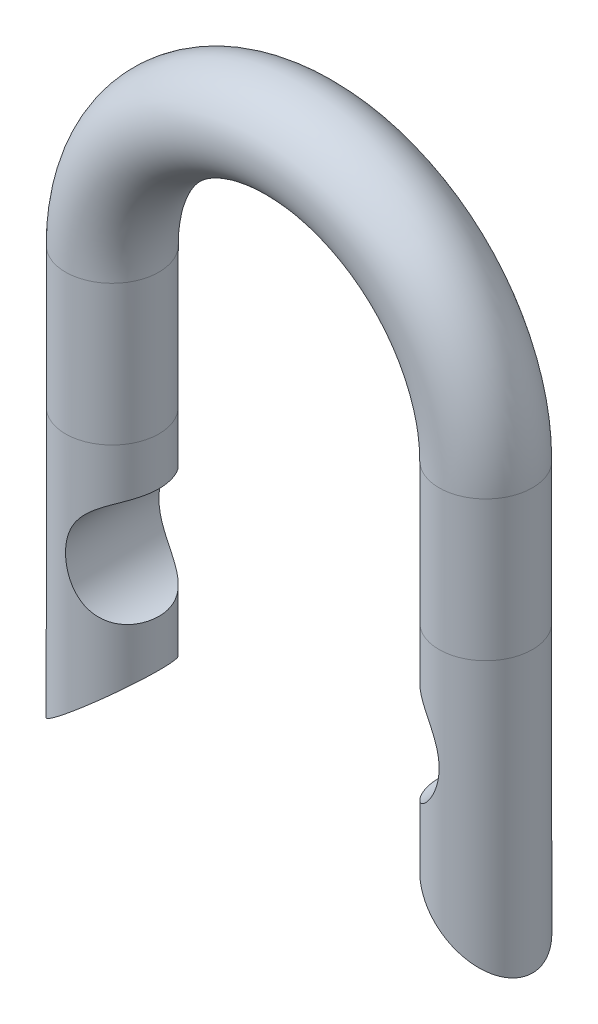
ISO-10303-21;
HEADER;
FILE_DESCRIPTION(('STEP AP214'),'2;1');
FILE_NAME('part.step','',(''),(''),'','','');
FILE_SCHEMA(('AUTOMOTIVE_DESIGN { 1 0 10303 214 1 1 1 1 }'));
ENDSEC;
DATA;
#1=APPLICATION_CONTEXT('core data for automotive mechanical design processes');
#2=APPLICATION_PROTOCOL_DEFINITION('international standard','automotive_design',2000,#1);
#3=PRODUCT_CONTEXT('',#1,'mechanical');
#4=PRODUCT('Part','Part','',(#3));
#5=PRODUCT_RELATED_PRODUCT_CATEGORY('part','',(#4));
#6=PRODUCT_DEFINITION_FORMATION('','',#4);
#7=PRODUCT_DEFINITION_CONTEXT('part definition',#1,'design');
#8=PRODUCT_DEFINITION('design','',#6,#7);
#9=PRODUCT_DEFINITION_SHAPE('','',#8);
#10=(LENGTH_UNIT() NAMED_UNIT(*) SI_UNIT(.MILLI.,.METRE.));
#11=(NAMED_UNIT(*) PLANE_ANGLE_UNIT() SI_UNIT($,.RADIAN.));
#12=(NAMED_UNIT(*) SI_UNIT($,.STERADIAN.) SOLID_ANGLE_UNIT());
#13=UNCERTAINTY_MEASURE_WITH_UNIT(LENGTH_MEASURE(1.E-05),#10,'distance_accuracy_value','');
#14=(GEOMETRIC_REPRESENTATION_CONTEXT(3) GLOBAL_UNCERTAINTY_ASSIGNED_CONTEXT((#13)) GLOBAL_UNIT_ASSIGNED_CONTEXT((#10,
#11,#12)) REPRESENTATION_CONTEXT('',''));
#15=CARTESIAN_POINT('',(0.,0.,0.));
#16=DIRECTION('',(0.,0.,1.));
#17=DIRECTION('',(1.,0.,0.));
#18=AXIS2_PLACEMENT_3D('',#15,#16,#17);
#19=CARTESIAN_POINT('',(0.,-30.,0.));
#20=DIRECTION('',(0.,1.,0.));
#21=DIRECTION('',(-1.,0.,0.));
#22=AXIS2_PLACEMENT_3D('',#19,#20,#21);
#23=CYLINDRICAL_SURFACE('',#22,5.);
#24=CARTESIAN_POINT('',(0.,0.,0.));
#25=DIRECTION('',(0.,-1.,0.));
#26=DIRECTION('',(1.,0.,0.));
#27=AXIS2_PLACEMENT_3D('',#24,#25,#26);
#28=CIRCLE('',#27,5.);
#29=CARTESIAN_POINT('',(5.,0.,0.));
#30=VERTEX_POINT('',#29);
#31=EDGE_CURVE('E131',#30,#30,#28,.T.);
#32=ORIENTED_EDGE('',*,*,#31,.T.);
#33=EDGE_LOOP('',(#32));
#34=FACE_BOUND('',#33,.T.);
#35=CARTESIAN_POINT('',(0.,-11.,-5.));
#36=CARTESIAN_POINT('',(1.01336783800378E-06,-11.1672925801468,-5.00000197803452));
#37=CARTESIAN_POINT('',(0.00700294385345058,-11.3346241016501,-5.00001524224182));
#38=CARTESIAN_POINT('',(0.0349715694115273,-11.6681851905817,-4.99989666422168));
#39=CARTESIAN_POINT('',(0.0559457322242584,-11.834414120699,-4.9997647443731));
#40=CARTESIAN_POINT('',(0.111789647046097,-12.1649643093046,-4.99882839915884));
#41=CARTESIAN_POINT('',(0.146694855048768,-12.3292795906052,-4.99802225203295));
#42=CARTESIAN_POINT('',(0.230145928593831,-12.6543708298637,-4.99487477657914));
#43=CARTESIAN_POINT('',(0.278689875745722,-12.8151472821572,-4.99253366409384));
#44=CARTESIAN_POINT('',(0.389162713133028,-13.1323120453173,-4.98514005902047));
#45=CARTESIAN_POINT('',(0.451116256336231,-13.2886916663659,-4.98008254673262));
#46=CARTESIAN_POINT('',(0.587862653343399,-13.5955704741037,-4.96579714411467));
#47=CARTESIAN_POINT('',(0.662656919850568,-13.7460690115324,-4.95656879473726));
#48=CARTESIAN_POINT('',(0.824246943154159,-14.039672919685,-4.9322692020561));
#49=CARTESIAN_POINT('',(0.911022474518513,-14.1827902028445,-4.91720772982427));
#50=CARTESIAN_POINT('',(1.09569186813046,-14.4605705269973,-4.87937828578128));
#51=CARTESIAN_POINT('',(1.1935821228077,-14.5952362892392,-4.85661280977911));
#52=CARTESIAN_POINT('',(1.37488784526161,-14.824180991063,-4.8079406341871));
#53=CARTESIAN_POINT('',(1.45627768794766,-14.9204984811257,-4.78403864642175));
#54=CARTESIAN_POINT('',(1.62396021911917,-15.1068201378297,-4.72974789953746));
#55=CARTESIAN_POINT('',(1.7102518365276,-15.1968256741517,-4.69936055355064));
#56=CARTESIAN_POINT('',(1.88671252194471,-15.3699118620849,-4.63133327985926));
#57=CARTESIAN_POINT('',(1.97687875140842,-15.45299745643,-4.59369859349857));
#58=CARTESIAN_POINT('',(2.15998853001141,-15.6118325943823,-4.51049434700005));
#59=CARTESIAN_POINT('',(2.25293212490629,-15.6875820170427,-4.46492465607754));
#60=CARTESIAN_POINT('',(2.44073891860501,-15.8317434599371,-4.36510662286157));
#61=CARTESIAN_POINT('',(2.53560945034013,-15.900116418207,-4.31081553815691));
#62=CARTESIAN_POINT('',(2.7253347593594,-16.0288879153695,-4.19344610079518));
#63=CARTESIAN_POINT('',(2.82018953661118,-16.0892864380785,-4.13036773030549));
#64=CARTESIAN_POINT('',(3.0083560839218,-16.2021250706699,-3.99539721518141));
#65=CARTESIAN_POINT('',(3.10166780150363,-16.254564910384,-3.92350477149123));
#66=CARTESIAN_POINT('',(3.28524187273531,-16.3517170487891,-3.77112873595935));
#67=CARTESIAN_POINT('',(3.37550436965556,-16.396429710956,-3.69064554850273));
#68=CARTESIAN_POINT('',(3.54434112740955,-16.4751889815033,-3.52848445564132));
#69=CARTESIAN_POINT('',(3.62326622768798,-16.5098102697967,-3.44744877088407));
#70=CARTESIAN_POINT('',(3.77644343900029,-16.5733900285891,-3.27893932747288));
#71=CARTESIAN_POINT('',(3.85069393086188,-16.6023465441858,-3.19146336057296));
#72=CARTESIAN_POINT('',(3.99364330429571,-16.6551161798921,-3.01066315708691));
#73=CARTESIAN_POINT('',(4.06234340245561,-16.6789304290569,-2.91734021010293));
#74=CARTESIAN_POINT('',(4.19354535772999,-16.7220182607628,-2.72538083419038));
#75=CARTESIAN_POINT('',(4.25604439552546,-16.7412897833767,-2.62674201956184));
#76=CARTESIAN_POINT('',(4.37684740629704,-16.7766349402529,-2.42035672065159));
#77=CARTESIAN_POINT('',(4.43484506182059,-16.7925301860826,-2.31240043176394));
#78=CARTESIAN_POINT('',(4.54291228696819,-16.820654104223,-2.09212825886974));
#79=CARTESIAN_POINT('',(4.59298133622372,-16.8328825359212,-1.97981208931833));
#80=CARTESIAN_POINT('',(4.68480487094448,-16.8542707573696,-1.75149908736753));
#81=CARTESIAN_POINT('',(4.7265560985081,-16.8634293456867,-1.63550083332144));
#82=CARTESIAN_POINT('',(4.80140231115474,-16.8791857964511,-1.4006165135319));
#83=CARTESIAN_POINT('',(4.83449975487999,-16.8857843864825,-1.28173127852735));
#84=CARTESIAN_POINT('',(4.89420545494826,-16.8973063128931,-1.03179398044238));
#85=CARTESIAN_POINT('',(4.92004866829745,-16.9020455080456,-0.900550082515578));
#86=CARTESIAN_POINT('',(4.96114196225866,-16.909417011739,-0.636353207497297));
#87=CARTESIAN_POINT('',(4.97639150207697,-16.9120492127214,-0.503400143507859));
#88=CARTESIAN_POINT('',(4.99618749969378,-16.9154426655211,-0.236645837589824));
#89=CARTESIAN_POINT('',(5.00073158971865,-16.9162035034422,-0.102844414586017));
#90=CARTESIAN_POINT('',(4.99907716495461,-16.9159237348083,0.164689947770474));
#91=CARTESIAN_POINT('',(4.99287855911732,-16.9148831129854,0.298422886533118));
#92=CARTESIAN_POINT('',(4.96939310831371,-16.9108373089725,0.569426996670404));
#93=CARTESIAN_POINT('',(4.95173980330404,-16.9077671337997,0.70666561653099));
#94=CARTESIAN_POINT('',(4.90513826618563,-16.8993082191888,0.979144195767172));
#95=CARTESIAN_POINT('',(4.87618967609224,-16.8939194062649,1.11438409165564));
#96=CARTESIAN_POINT('',(4.80722729922888,-16.8803509783983,1.38190028396456));
#97=CARTESIAN_POINT('',(4.76721143035376,-16.8721708382509,1.51417601766539));
#98=CARTESIAN_POINT('',(4.6764657992479,-16.8523851829379,1.77473875520055));
#99=CARTESIAN_POINT('',(4.6257362405089,-16.8407797328297,1.90302583474078));
#100=CARTESIAN_POINT('',(4.51456210787274,-16.8134944525269,2.15344402742041));
#101=CARTESIAN_POINT('',(4.45421160627154,-16.7978532501379,2.27562105974464));
#102=CARTESIAN_POINT('',(4.32410024943759,-16.7615898813437,2.51408049301391));
#103=CARTESIAN_POINT('',(4.25434016954927,-16.740968125223,2.63036337854864));
#104=CARTESIAN_POINT('',(4.10627328170704,-16.6938412547095,2.85599631875508));
#105=CARTESIAN_POINT('',(4.02797195998117,-16.6673399057286,2.9653507531845));
#106=CARTESIAN_POINT('',(3.86383081902116,-16.6075310734903,3.1762653939161));
#107=CARTESIAN_POINT('',(3.77799166070537,-16.5742241866041,3.27782628209697));
#108=CARTESIAN_POINT('',(3.60597684458867,-16.5024312068577,3.465843735025));
#109=CARTESIAN_POINT('',(3.52020272370516,-16.4644364607337,3.55285554936384));
#110=CARTESIAN_POINT('',(3.34443611867584,-16.3812108589448,3.71878343810715));
#111=CARTESIAN_POINT('',(3.2544438576947,-16.3359803857881,3.79769994009897));
#112=CARTESIAN_POINT('',(3.07166582163871,-16.2379010507893,3.94699736365622));
#113=CARTESIAN_POINT('',(2.97888150181223,-16.1850561050799,4.0173826387894));
#114=CARTESIAN_POINT('',(2.79194766846745,-16.0715237720856,4.14947297942389));
#115=CARTESIAN_POINT('',(2.69779821211652,-16.0108367123652,4.21117840725692));
#116=CARTESIAN_POINT('',(2.51663436791631,-15.886443034579,4.32168507456124));
#117=CARTESIAN_POINT('',(2.42961052305963,-15.8232974186078,4.37110495422635));
#118=CARTESIAN_POINT('',(2.25677429851572,-15.6904312417553,4.46279550411627));
#119=CARTESIAN_POINT('',(2.17096234524144,-15.6207084297976,4.50506371271952));
#120=CARTESIAN_POINT('',(2.00164106665452,-15.4749972961191,4.58280626690303));
#121=CARTESIAN_POINT('',(1.91813148928324,-15.3990096639198,4.61828135872603));
#122=CARTESIAN_POINT('',(1.75430171027042,-15.241107880852,4.68296771866402));
#123=CARTESIAN_POINT('',(1.67398271208117,-15.1591915259989,4.71217664118806));
#124=CARTESIAN_POINT('',(1.51342367155993,-14.9856367230723,4.76624400390401));
#125=CARTESIAN_POINT('',(1.43339007081028,-14.893716645375,4.79081037881119));
#126=CARTESIAN_POINT('',(1.27847493343338,-14.7043454961125,4.83445783581607));
#127=CARTESIAN_POINT('',(1.20359555036516,-14.6068921432715,4.85353663552585));
#128=CARTESIAN_POINT('',(1.05961441046474,-14.4070168762363,4.88699110550942));
#129=CARTESIAN_POINT('',(0.990513737163655,-14.304594035907,4.90136589522799));
#130=CARTESIAN_POINT('',(0.858575926418677,-14.0953293498117,4.92619063820214));
#131=CARTESIAN_POINT('',(0.795739514351063,-13.9884869943055,4.93664013731175));
#132=CARTESIAN_POINT('',(0.666843550591963,-13.7528774145726,4.95582929010031));
#133=CARTESIAN_POINT('',(0.60197514434783,-13.6234107191739,4.9639987298238));
#134=CARTESIAN_POINT('',(0.48171902886084,-13.3599884317115,4.97710819747061));
#135=CARTESIAN_POINT('',(0.426332154627238,-13.2260324455307,4.98204794107245));
#136=CARTESIAN_POINT('',(0.325360177774828,-12.9543472762797,4.9896599689942));
#137=CARTESIAN_POINT('',(0.279779455592821,-12.8166164378148,4.99233124154527));
#138=CARTESIAN_POINT('',(0.198708727167981,-12.5381958439052,4.99621465166712));
#139=CARTESIAN_POINT('',(0.163219205918918,-12.3975059465937,4.99742671911602));
#140=CARTESIAN_POINT('',(0.0984924054892949,-12.0950741126401,4.99914895651438));
#141=CARTESIAN_POINT('',(0.0707114976076093,-11.9330178432994,4.99954452650008));
#142=CARTESIAN_POINT('',(0.0285389473373053,-11.607163973421,4.99996292888112));
#143=CARTESIAN_POINT('',(0.0141484027150768,-11.4433662312274,4.99998573071878));
#144=CARTESIAN_POINT('',(-0.00114534127759506,-11.1151177837661,5.00000581531103));
#145=CARTESIAN_POINT('',(-0.00204666289751859,-10.9506669907784,5.00000309451284));
#146=CARTESIAN_POINT('',(0.00964912549334279,-10.6222483515103,4.99999401562876));
#147=CARTESIAN_POINT('',(0.0222461739106748,-10.4582805030295,4.99998765755946));
#148=CARTESIAN_POINT('',(0.0613602917098796,-10.1276531704375,4.9996628502361));
#149=CARTESIAN_POINT('',(0.088233342704779,-9.96103568583118,4.99933623034002));
#150=CARTESIAN_POINT('',(0.155915407421652,-9.63065341419806,4.9976828947871));
#151=CARTESIAN_POINT('',(0.196724971284217,-9.46688874005353,4.99635613964767));
#152=CARTESIAN_POINT('',(0.292017942210682,-9.14327936115905,4.99169323766335));
#153=CARTESIAN_POINT('',(0.346511479138238,-8.98343765712824,4.98835559964535));
#154=CARTESIAN_POINT('',(0.468735520316024,-8.66899977092882,4.97835761639618));
#155=CARTESIAN_POINT('',(0.5364656772879,-8.51440345126622,4.97169735833076));
#156=CARTESIAN_POINT('',(0.684036998870277,-8.21279472978758,4.95354186067828));
#157=CARTESIAN_POINT('',(0.763785538316597,-8.06573495799586,4.94208249930568));
#158=CARTESIAN_POINT('',(0.934971313376137,-7.7792354240144,4.91257250014844));
#159=CARTESIAN_POINT('',(1.02640943752949,-7.63979624222666,4.8945213611206));
#160=CARTESIAN_POINT('',(1.21966538251949,-7.37014340733225,4.84997185062209));
#161=CARTESIAN_POINT('',(1.32146189071916,-7.23991170975088,4.82349059445501));
#162=CARTESIAN_POINT('',(1.5340495006407,-6.98973899863895,4.76014414032647));
#163=CARTESIAN_POINT('',(1.64483679967864,-6.86979367814771,4.72328331631152));
#164=CARTESIAN_POINT('',(1.84235663141479,-6.67242745544965,4.64904699210233));
#165=CARTESIAN_POINT('',(1.9274665394985,-6.59229455007946,4.61452098890251));
#166=CARTESIAN_POINT('',(2.10040070808419,-6.43858624102623,4.53841763443072));
#167=CARTESIAN_POINT('',(2.18822436992665,-6.36500940477504,4.49684182940497));
#168=CARTESIAN_POINT('',(2.36543460815921,-6.2247830849532,4.40620202742989));
#169=CARTESIAN_POINT('',(2.45482025876951,-6.15812965043007,4.35714234118277));
#170=CARTESIAN_POINT('',(2.63398679064456,-6.03190541586923,4.25122816751938));
#171=CARTESIAN_POINT('',(2.72376768464208,-5.97233484576346,4.19437342718018));
#172=CARTESIAN_POINT('',(2.90262156398862,-5.86021286541557,4.07265409575176));
#173=CARTESIAN_POINT('',(2.99169272152231,-5.80767609006022,4.00777332847161));
#174=CARTESIAN_POINT('',(3.16764878343352,-5.70963778731315,3.87020307576345));
#175=CARTESIAN_POINT('',(3.2545336828834,-5.66413627577707,3.79751357273722));
#176=CARTESIAN_POINT('',(3.42491545213415,-5.57985431104011,3.64459360564037));
#177=CARTESIAN_POINT('',(3.50841112969204,-5.54107620753858,3.5643605202831));
#178=CARTESIAN_POINT('',(3.6708609400847,-5.4698118072156,3.39682131530969));
#179=CARTESIAN_POINT('',(3.74981507224416,-5.43732551132971,3.30951519464183));
#180=CARTESIAN_POINT('',(3.90007175823033,-5.37891302567467,3.13092285408266));
#181=CARTESIAN_POINT('',(3.9715264214635,-5.35282896628892,3.03981588200658));
#182=CARTESIAN_POINT('',(4.10848258645064,-5.30549255887314,2.85199660943286));
#183=CARTESIAN_POINT('',(4.17398197357312,-5.28424192313032,2.75528233767391));
#184=CARTESIAN_POINT('',(4.2983698185709,-5.24598483796435,2.55689754562903));
#185=CARTESIAN_POINT('',(4.35725832795224,-5.22897835547329,2.45522706396632));
#186=CARTESIAN_POINT('',(4.4679217680021,-5.19861832544165,2.24755894799921));
#187=CARTESIAN_POINT('',(4.51969618566185,-5.18526504127042,2.14156100234849));
#188=CARTESIAN_POINT('',(4.61940341247877,-5.16075436629791,1.91761871539131));
#189=CARTESIAN_POINT('',(4.66673866195054,-5.14984335305128,1.79938104842716));
#190=CARTESIAN_POINT('',(4.75228984651378,-5.13100197776122,1.55947321411887));
#191=CARTESIAN_POINT('',(4.7905089231773,-5.12307058835067,1.43780424546382));
#192=CARTESIAN_POINT('',(4.85758442499308,-5.10966400561992,1.19170041349024));
#193=CARTESIAN_POINT('',(4.88643507189275,-5.10419032737137,1.06726389356147));
#194=CARTESIAN_POINT('',(4.93453025422671,-5.09530934887665,0.816519550397981));
#195=CARTESIAN_POINT('',(4.95377778345116,-5.09190140456271,0.690212323019747));
#196=CARTESIAN_POINT('',(4.98351855047543,-5.08670887169716,0.427917854318254));
#197=CARTESIAN_POINT('',(4.9933357690019,-5.08504891142885,0.291851022306593));
#198=CARTESIAN_POINT('',(5.00182055025379,-5.08361127365501,0.0193565511971217));
#199=CARTESIAN_POINT('',(5.00048759470208,-5.08383368364494,-0.117071104377667));
#200=CARTESIAN_POINT('',(4.98667963654545,-5.08618304201028,-0.389378000480964));
#201=CARTESIAN_POINT('',(4.97420204173783,-5.08831043347777,-0.525257106032165));
#202=CARTESIAN_POINT('',(4.93819512892386,-5.09467156589992,-0.795493563495937));
#203=CARTESIAN_POINT('',(4.91466582329191,-5.09890530449613,-0.929850917112215));
#204=CARTESIAN_POINT('',(4.85628846397197,-5.10993888194162,-1.1981661717741));
#205=CARTESIAN_POINT('',(4.82127066810688,-5.11677746772665,-1.33208562156166));
#206=CARTESIAN_POINT('',(4.74032071534937,-5.13357728575698,-1.59639012800332));
#207=CARTESIAN_POINT('',(4.69438831931214,-5.14353858642417,-1.72677510714551));
#208=CARTESIAN_POINT('',(4.59203125953526,-5.16730056663391,-1.98299731321197));
#209=CARTESIAN_POINT('',(4.53560704123407,-5.18110108319191,-2.1088347329356));
#210=CARTESIAN_POINT('',(4.41283572153215,-5.21338305454907,-2.35494977371156));
#211=CARTESIAN_POINT('',(4.34648902263519,-5.23186431949554,-2.47522762002809));
#212=CARTESIAN_POINT('',(4.20664270606172,-5.27382823069452,-2.70588739122247));
#213=CARTESIAN_POINT('',(4.13339981481461,-5.2971538921632,-2.81645336886743));
#214=CARTESIAN_POINT('',(3.9791470537767,-5.34997386542833,-3.03047602227765));
#215=CARTESIAN_POINT('',(3.89813732185154,-5.37946806774081,-3.13393282417871));
#216=CARTESIAN_POINT('',(3.72953560388892,-5.4454365872777,-3.33279786087936));
#217=CARTESIAN_POINT('',(3.64194959804226,-5.48190460839312,-3.42821324453904));
#218=CARTESIAN_POINT('',(3.46146747805199,-5.56257278082289,-3.61035662754536));
#219=CARTESIAN_POINT('',(3.36857187367415,-5.60677219069609,-3.69708545868037));
#220=CARTESIAN_POINT('',(3.18699902137051,-5.69938509081601,-3.85437802101852));
#221=CARTESIAN_POINT('',(3.09862586928419,-5.74712969880204,-3.92568807062417));
#222=CARTESIAN_POINT('',(2.92000284068231,-5.84983240392201,-4.06030644804167));
#223=CARTESIAN_POINT('',(2.82975308571313,-5.90479003509023,-4.12361529221816));
#224=CARTESIAN_POINT('',(2.64871347938608,-6.02199788247727,-4.2421724229193));
#225=CARTESIAN_POINT('',(2.55792366468142,-6.08424760903168,-4.29742125011553));
#226=CARTESIAN_POINT('',(2.37710987495138,-6.21594574781886,-4.40001768120705));
#227=CARTESIAN_POINT('',(2.28708590416816,-6.28539419989864,-4.44736524136276));
#228=CARTESIAN_POINT('',(2.11242892996256,-6.42845244138445,-4.53285096696557));
#229=CARTESIAN_POINT('',(2.02772113973742,-6.50180332759979,-4.57127100985421));
#230=CARTESIAN_POINT('',(1.86111145249964,-6.65461350236863,-4.64159939377848));
#231=CARTESIAN_POINT('',(1.77921054461105,-6.73407491286854,-4.67350545857798));
#232=CARTESIAN_POINT('',(1.61911287215164,-6.89865791335757,-4.73135487821605));
#233=CARTESIAN_POINT('',(1.540915543957,-6.98377863732221,-4.75729914267219));
#234=CARTESIAN_POINT('',(1.3888999458614,-7.15926565736508,-4.80388180944362));
#235=CARTESIAN_POINT('',(1.31508328646273,-7.24963385875621,-4.82451826958843));
#236=CARTESIAN_POINT('',(1.16484445947853,-7.44499968966658,-4.86310374195765));
#237=CARTESIAN_POINT('',(1.08898190389536,-7.55053042678984,-4.88053255721199));
#238=CARTESIAN_POINT('',(0.943971532067581,-7.76680672092637,-4.91064205727372));
#239=CARTESIAN_POINT('',(0.874826599233232,-7.87755448722895,-4.9233207097763));
#240=CARTESIAN_POINT('',(0.743719955945229,-8.10368946328402,-4.9448253700601));
#241=CARTESIAN_POINT('',(0.681763733297821,-8.21908012806353,-4.95364844855427));
#242=CARTESIAN_POINT('',(0.565465810692731,-8.45382615009492,-4.96826761972822));
#243=CARTESIAN_POINT('',(0.511124874954786,-8.57318190377218,-4.97406340876823));
#244=CARTESIAN_POINT('',(0.401610707399,-8.83627527772127,-4.9841991200533));
#245=CARTESIAN_POINT('',(0.347927407710223,-8.9806516440661,-4.98811226185841));
#246=CARTESIAN_POINT('',(0.251804552002113,-9.27316515003156,-4.99388761677033));
#247=CARTESIAN_POINT('',(0.209367415164503,-9.42130309131333,-4.99574938887497));
#248=CARTESIAN_POINT('',(0.136069743614112,-9.72017193341972,-4.99828248880431));
#249=CARTESIAN_POINT('',(0.105190929610648,-9.87089834234585,-4.99895570263522));
#250=CARTESIAN_POINT('',(0.0551110613435154,-10.1742228725721,-4.99975937827056));
#251=CARTESIAN_POINT('',(0.035904678423253,-10.326820107302,-4.99989008789619));
#252=CARTESIAN_POINT('',(0.0150599140563901,-10.5663751334625,-4.99998226981772));
#253=CARTESIAN_POINT('',(0.00941367173601581,-10.653002397165,-4.99999263382837));
#254=CARTESIAN_POINT('',(0.00188351728775758,-10.8264162834859,-5.00000098556825));
#255=CARTESIAN_POINT('',(-5.25769809595577E-07,-10.9132029004535,-4.99999897372819));
#256=CARTESIAN_POINT('',(0.,-11.,-5.));
#257=B_SPLINE_CURVE_WITH_KNOTS('',3,(#35,#36,#37,#38,#39,#40,#41,#42,#43,#44,#45,#46,#47,#48,
#49,#50,#51,#52,#53,#54,#55,#56,#57,#58,#59,#60,#61,#62,#63,#64,#65,#66,#67,#68,#69,#70,#71,#72,
#73,#74,#75,#76,#77,#78,#79,#80,#81,#82,#83,#84,#85,#86,#87,#88,#89,#90,#91,#92,#93,#94,#95,#96,
#97,#98,#99,#100,#101,#102,#103,#104,#105,#106,#107,#108,#109,#110,#111,#112,#113,#114,#115,
#116,#117,#118,#119,#120,#121,#122,#123,#124,#125,#126,#127,#128,#129,#130,#131,#132,#133,#134,
#135,#136,#137,#138,#139,#140,#141,#142,#143,#144,#145,#146,#147,#148,#149,#150,#151,#152,#153,
#154,#155,#156,#157,#158,#159,#160,#161,#162,#163,#164,#165,#166,#167,#168,#169,#170,#171,#172,
#173,#174,#175,#176,#177,#178,#179,#180,#181,#182,#183,#184,#185,#186,#187,#188,#189,#190,#191,
#192,#193,#194,#195,#196,#197,#198,#199,#200,#201,#202,#203,#204,#205,#206,#207,#208,#209,#210,
#211,#212,#213,#214,#215,#216,#217,#218,#219,#220,#221,#222,#223,#224,#225,#226,#227,#228,#229,
#230,#231,#232,#233,#234,#235,#236,#237,#238,#239,#240,#241,#242,#243,#244,#245,#246,#247,#248,
#249,#250,#251,#252,#253,#254,#255,#256),.UNSPECIFIED.,.T.,.F.,(4,2,2,2,2,2,2,2,2,2,2,2,2,2,2,2,
2,2,2,2,2,2,2,2,2,2,2,2,2,2,2,2,2,2,2,2,2,2,2,2,2,2,2,2,2,2,2,2,2,2,2,2,2,2,2,2,2,2,2,2,2,2,2,2,
2,2,2,2,2,2,2,2,2,2,2,2,2,2,2,2,2,2,2,2,2,2,2,2,2,2,2,2,2,2,2,2,2,2,2,2,2,2,2,2,2,2,2,2,2,2,4),
(0.,0.501798976014393,1.00386636397993,1.50721979971682,2.0105024704494,2.51471838520234,
3.0189898080775,3.52242015347854,4.02568756216706,4.41034931729312,4.79492734166724,
5.17922827314541,5.56353553926814,5.94978717490041,6.33603959439054,6.72230512280436,
7.1085524768674,7.46304486874609,7.81765938030287,8.172195952029,8.52689298259653,
8.89722361330791,9.2675785394122,9.63807824115556,10.0084725648931,10.4095611392678,
10.8106701872054,11.211867941953,11.6130690970189,12.0277841917847,12.4425124313005,
12.8573187474505,13.2721171856361,13.6830838835747,14.094016738731,14.5046871798439,
14.9153216492117,15.2986643914182,15.6819868753574,16.0651129151069,16.4482229568861,
16.8028161895592,17.1575312268314,17.512207275289,17.8670158574962,18.2396389199828,
18.6124167401881,18.9852643017295,19.3581549874935,19.7928326506535,20.227548574862,
20.6624582865842,21.0973888969947,21.5900834530917,22.0828183976288,22.5756219320834,
23.0684232178709,23.5741330795972,24.0798629064101,24.5859682202946,25.0920602576908,
25.5944344375185,26.0968468261734,26.5982456250492,27.0994334500209,27.4647278833507,
27.8299422993604,28.1949471413321,28.5599638292697,28.9257285633982,29.2914941218527,
29.657387251665,30.0232804358836,30.3789551547458,30.7347556792537,31.0905534314901,
31.4463768274333,31.8294412712739,32.2123735139256,32.5955414945776,32.9785899471276,
33.3874066820104,33.7962424194251,34.205173275321,34.614103673345,35.0293707353919,
35.4446468970036,35.8599054317671,36.2751471262037,36.6785932593248,37.0820322323831,
37.4851086773778,37.8881464884627,38.2572243614306,38.6262784034667,38.9953076777047,
39.3643389947353,39.7193280192098,40.0744408790734,40.4294995218089,40.784687899268,
41.1776998208789,41.5708796968164,41.9643577754916,42.3578753127864,42.8196365006091,
43.2814969382065,43.7426238339705,44.2035400592876,44.4638995532797,44.7242499862472),.UNSPECIFIED.);
#258=CARTESIAN_POINT('',(0.,-11.,-5.));
#259=VERTEX_POINT('',#258);
#260=EDGE_CURVE('E64',#259,#259,#257,.T.);
#261=ORIENTED_EDGE('',*,*,#260,.T.);
#262=EDGE_LOOP('',(#261));
#263=FACE_BOUND('',#262,.T.);
#264=CARTESIAN_POINT('',(0.,-25.9580398915498,0.));
#265=DIRECTION('',(-0.628666366380633,0.777675124831554,0.));
#266=DIRECTION('',(0.777675124831554,0.628666366380633,0.));
#267=AXIS2_PLACEMENT_3D('',#264,#265,#266);
#268=ELLIPSE('',#267,6.42941999859261,5.);
#269=CARTESIAN_POINT('',(5.,-21.9160797830996,0.));
#270=VERTEX_POINT('',#269);
#271=EDGE_CURVE('E11',#270,#270,#268,.T.);
#272=ORIENTED_EDGE('',*,*,#271,.T.);
#273=EDGE_LOOP('',(#272));
#274=FACE_BOUND('',#273,.T.);
#275=ADVANCED_FACE('F52',(#34,#263,#274),#23,.T.);
#276=CARTESIAN_POINT('',(0.,0.,0.));
#277=DIRECTION('',(0.,1.,0.));
#278=DIRECTION('',(-1.,0.,0.));
#279=AXIS2_PLACEMENT_3D('',#276,#277,#278);
#280=CYLINDRICAL_SURFACE('',#279,5.);
#281=CARTESIAN_POINT('',(0.,15.,0.));
#282=DIRECTION('',(0.,-1.,0.));
#283=DIRECTION('',(1.,0.,0.));
#284=AXIS2_PLACEMENT_3D('',#281,#282,#283);
#285=CIRCLE('',#284,5.);
#286=CARTESIAN_POINT('',(-5.,15.,0.));
#287=VERTEX_POINT('',#286);
#288=EDGE_CURVE('E126',#287,#287,#285,.T.);
#289=ORIENTED_EDGE('',*,*,#288,.T.);
#290=EDGE_LOOP('',(#289));
#291=FACE_BOUND('',#290,.T.);
#292=ORIENTED_EDGE('',*,*,#31,.F.);
#293=EDGE_LOOP('',(#292));
#294=FACE_BOUND('',#293,.T.);
#295=ADVANCED_FACE('F93',(#291,#294),#280,.T.);
#296=CARTESIAN_POINT('',(20.,15.,0.));
#297=DIRECTION('',(0.,0.,-1.));
#298=DIRECTION('',(-1.,0.,0.));
#299=AXIS2_PLACEMENT_3D('',#296,#297,#298);
#300=TOROIDAL_SURFACE('',#299,20.,5.);
#301=CARTESIAN_POINT('',(40.,15.,0.));
#302=DIRECTION('',(0.,1.,0.));
#303=DIRECTION('',(-1.,0.,0.));
#304=AXIS2_PLACEMENT_3D('',#301,#302,#303);
#305=CIRCLE('',#304,5.);
#306=CARTESIAN_POINT('',(45.,15.,0.));
#307=VERTEX_POINT('',#306);
#308=EDGE_CURVE('E124',#307,#307,#305,.T.);
#309=CARTESIAN_POINT('',(20.,15.,0.));
#310=DIRECTION('',(0.,0.,-1.));
#311=DIRECTION('',(-1.,0.,0.));
#312=AXIS2_PLACEMENT_3D('',#309,#310,#311);
#313=CIRCLE('',#312,25.);
#314=EDGE_CURVE('',#287,#307,#313,.T.);
#315=ORIENTED_EDGE('',*,*,#288,.F.);
#316=ORIENTED_EDGE('',*,*,#308,.T.);
#317=ORIENTED_EDGE('',*,*,#314,.T.);
#318=ORIENTED_EDGE('',*,*,#314,.F.);
#319=EDGE_LOOP('',(#315,#317,#316,#318));
#320=FACE_BOUND('',#319,.T.);
#321=ADVANCED_FACE('F107',(#320),#300,.T.);
#322=CARTESIAN_POINT('',(40.,15.,0.));
#323=DIRECTION('',(0.,-1.,0.));
#324=DIRECTION('',(0.,0.,-1.));
#325=AXIS2_PLACEMENT_3D('',#322,#323,#324);
#326=CYLINDRICAL_SURFACE('',#325,5.);
#327=CARTESIAN_POINT('',(40.,0.,0.));
#328=DIRECTION('',(0.,1.,0.));
#329=DIRECTION('',(-1.,0.,0.));
#330=AXIS2_PLACEMENT_3D('',#327,#328,#329);
#331=CIRCLE('',#330,5.);
#332=CARTESIAN_POINT('',(35.,0.,0.));
#333=VERTEX_POINT('',#332);
#334=EDGE_CURVE('E123',#333,#333,#331,.T.);
#335=ORIENTED_EDGE('',*,*,#334,.T.);
#336=EDGE_LOOP('',(#335));
#337=FACE_BOUND('',#336,.T.);
#338=ORIENTED_EDGE('',*,*,#308,.F.);
#339=EDGE_LOOP('',(#338));
#340=FACE_BOUND('',#339,.T.);
#341=ADVANCED_FACE('F112',(#337,#340),#326,.T.);
#342=CARTESIAN_POINT('',(40.,0.,0.));
#343=DIRECTION('',(0.,-1.,0.));
#344=DIRECTION('',(1.,0.,0.));
#345=AXIS2_PLACEMENT_3D('',#342,#343,#344);
#346=CYLINDRICAL_SURFACE('',#345,5.);
#347=CARTESIAN_POINT('',(40.,-11.,-5.));
#348=CARTESIAN_POINT('',(39.9999989866322,-10.8327074198532,-5.00000197803452));
#349=CARTESIAN_POINT('',(39.9929970561466,-10.6653758983499,-5.00001524224182));
#350=CARTESIAN_POINT('',(39.9650284305885,-10.3318148094183,-4.99989666422168));
#351=CARTESIAN_POINT('',(39.9440542677758,-10.165585879301,-4.9997647443731));
#352=CARTESIAN_POINT('',(39.8882103529539,-9.83503569069541,-4.99882839915884));
#353=CARTESIAN_POINT('',(39.8533051449512,-9.67072040939484,-4.99802225203295));
#354=CARTESIAN_POINT('',(39.7698540714062,-9.34562917013631,-4.99487477657914));
#355=CARTESIAN_POINT('',(39.7213101242543,-9.18485271784277,-4.99253366409384));
#356=CARTESIAN_POINT('',(39.610837286867,-8.8676879546827,-4.98514005902047));
#357=CARTESIAN_POINT('',(39.5488837436638,-8.71130833363412,-4.98008254673263));
#358=CARTESIAN_POINT('',(39.4121373466566,-8.40442952589632,-4.96579714411467));
#359=CARTESIAN_POINT('',(39.3373430801495,-8.25393098846759,-4.95656879473727));
#360=CARTESIAN_POINT('',(39.1757530568459,-7.96032708031495,-4.9322692020561));
#361=CARTESIAN_POINT('',(39.0889775254815,-7.81720979715544,-4.91720772982427));
#362=CARTESIAN_POINT('',(38.9043081318696,-7.53942947300266,-4.87937828578129));
#363=CARTESIAN_POINT('',(38.8064178771923,-7.40476371076075,-4.85661280977911));
#364=CARTESIAN_POINT('',(38.6251121547384,-7.17581900893698,-4.8079406341871));
#365=CARTESIAN_POINT('',(38.5437223120524,-7.07950151887427,-4.78403864642176));
#366=CARTESIAN_POINT('',(38.3760397808808,-6.89317986217032,-4.72974789953747));
#367=CARTESIAN_POINT('',(38.2897481634724,-6.80317432584824,-4.69936055355064));
#368=CARTESIAN_POINT('',(38.1132874780553,-6.63008813791506,-4.63133327985927));
#369=CARTESIAN_POINT('',(38.0231212485916,-6.54700254356996,-4.59369859349857));
#370=CARTESIAN_POINT('',(37.8400114699886,-6.38816740561772,-4.51049434700006));
#371=CARTESIAN_POINT('',(37.7470678750937,-6.31241798295733,-4.46492465607755));
#372=CARTESIAN_POINT('',(37.559261081395,-6.1682565400629,-4.36510662286158));
#373=CARTESIAN_POINT('',(37.4643905496599,-6.09988358179303,-4.31081553815691));
#374=CARTESIAN_POINT('',(37.2746652406406,-5.97111208463053,-4.19344610079518));
#375=CARTESIAN_POINT('',(37.1798104633888,-5.91071356192144,-4.13036773030549));
#376=CARTESIAN_POINT('',(36.9916439160782,-5.79787492933011,-3.99539721518142));
#377=CARTESIAN_POINT('',(36.8983321984964,-5.745435089616,-3.92350477149123));
#378=CARTESIAN_POINT('',(36.7147581272647,-5.64828295121087,-3.77112873595935));
#379=CARTESIAN_POINT('',(36.6244956303444,-5.603570289044,-3.69064554850274));
#380=CARTESIAN_POINT('',(36.4556588725905,-5.52481101849667,-3.52848445564133));
#381=CARTESIAN_POINT('',(36.376733772312,-5.49018973020326,-3.44744877088408));
#382=CARTESIAN_POINT('',(36.2235565609997,-5.42660997141092,-3.27893932747289));
#383=CARTESIAN_POINT('',(36.1493060691381,-5.39765345581423,-3.19146336057296));
#384=CARTESIAN_POINT('',(36.0063566957043,-5.3448838201079,-3.01066315708692));
#385=CARTESIAN_POINT('',(35.9376565975444,-5.32106957094308,-2.91734021010294));
#386=CARTESIAN_POINT('',(35.80645464227,-5.27798173923716,-2.72538083419039));
#387=CARTESIAN_POINT('',(35.7439556044746,-5.25871021662328,-2.62674201956185));
#388=CARTESIAN_POINT('',(35.623152593703,-5.22336505974707,-2.4203567206516));
#389=CARTESIAN_POINT('',(35.5651549381794,-5.2074698139174,-2.31240043176395));
#390=CARTESIAN_POINT('',(35.4570877130318,-5.17934589577699,-2.09212825886974));
#391=CARTESIAN_POINT('',(35.4070186637763,-5.16711746407876,-1.97981208931834));
#392=CARTESIAN_POINT('',(35.3151951290555,-5.14572924263039,-1.75149908736754));
#393=CARTESIAN_POINT('',(35.2734439014919,-5.13657065431331,-1.63550083332144));
#394=CARTESIAN_POINT('',(35.1985976888453,-5.12081420354891,-1.40061651353191));
#395=CARTESIAN_POINT('',(35.16550024512,-5.11421561351749,-1.28173127852735));
#396=CARTESIAN_POINT('',(35.1057945450517,-5.10269368710694,-1.03179398044239));
#397=CARTESIAN_POINT('',(35.0799513317026,-5.09795449195436,-0.900550082515587));
#398=CARTESIAN_POINT('',(35.0388580377413,-5.09058298826102,-0.636353207497306));
#399=CARTESIAN_POINT('',(35.023608497923,-5.08795078727862,-0.503400143507867));
#400=CARTESIAN_POINT('',(35.0038125003062,-5.08455733447886,-0.236645837589833));
#401=CARTESIAN_POINT('',(34.9992684102814,-5.08379649655784,-0.102844414586026));
#402=CARTESIAN_POINT('',(35.0009228350454,-5.08407626519169,0.164689947770464));
#403=CARTESIAN_POINT('',(35.0071214408827,-5.08511688701461,0.298422886533109));
#404=CARTESIAN_POINT('',(35.0306068916863,-5.08916269102748,0.569426996670395));
#405=CARTESIAN_POINT('',(35.048260196696,-5.09223286620029,0.706665616530982));
#406=CARTESIAN_POINT('',(35.0948617338144,-5.1006917808112,0.979144195767165));
#407=CARTESIAN_POINT('',(35.1238103239078,-5.10608059373509,1.11438409165563));
#408=CARTESIAN_POINT('',(35.1927727007711,-5.11964902160169,1.38190028396455));
#409=CARTESIAN_POINT('',(35.2327885696462,-5.12782916174911,1.51417601766538));
#410=CARTESIAN_POINT('',(35.3235342007521,-5.14761481706208,1.77473875520054));
#411=CARTESIAN_POINT('',(35.3742637594911,-5.15922026717025,1.90302583474077));
#412=CARTESIAN_POINT('',(35.4854378921273,-5.18650554747307,2.1534440274204));
#413=CARTESIAN_POINT('',(35.5457883937285,-5.20214674986208,2.27562105974463));
#414=CARTESIAN_POINT('',(35.6758997505624,-5.23841011865628,2.5140804930139));
#415=CARTESIAN_POINT('',(35.7456598304507,-5.25903187477695,2.63036337854863));
#416=CARTESIAN_POINT('',(35.893726718293,-5.30615874529047,2.85599631875507));
#417=CARTESIAN_POINT('',(35.9720280400188,-5.33266009427138,2.9653507531845));
#418=CARTESIAN_POINT('',(36.1361691809788,-5.39246892650971,3.17626539391609));
#419=CARTESIAN_POINT('',(36.2220083392946,-5.4257758133959,3.27782628209697));
#420=CARTESIAN_POINT('',(36.3940231554113,-5.4975687931423,3.46584373502499));
#421=CARTESIAN_POINT('',(36.4797972762948,-5.53556353926627,3.55285554936384));
#422=CARTESIAN_POINT('',(36.6555638813242,-5.61878914105514,3.71878343810714));
#423=CARTESIAN_POINT('',(36.7455561423053,-5.66401961421191,3.79769994009896));
#424=CARTESIAN_POINT('',(36.9283341783613,-5.76209894921069,3.94699736365622));
#425=CARTESIAN_POINT('',(37.0211184981878,-5.81494389492008,4.0173826387894));
#426=CARTESIAN_POINT('',(37.2080523315325,-5.92847622791433,4.14947297942389));
#427=CARTESIAN_POINT('',(37.3022017878835,-5.98916328763481,4.21117840725692));
#428=CARTESIAN_POINT('',(37.4833656320837,-6.11355696542098,4.32168507456124));
#429=CARTESIAN_POINT('',(37.5703894769404,-6.17670258139218,4.37110495422635));
#430=CARTESIAN_POINT('',(37.7432257014843,-6.30956875824467,4.46279550411626));
#431=CARTESIAN_POINT('',(37.8290376547586,-6.37929157020242,4.50506371271952));
#432=CARTESIAN_POINT('',(37.9983589333455,-6.52500270388083,4.58280626690303));
#433=CARTESIAN_POINT('',(38.0818685107168,-6.60099033608013,4.61828135872603));
#434=CARTESIAN_POINT('',(38.2456982897296,-6.75889211914802,4.68296771866402));
#435=CARTESIAN_POINT('',(38.3260172879188,-6.84080847400103,4.71217664118806));
#436=CARTESIAN_POINT('',(38.4865763284401,-7.01436327692772,4.76624400390401));
#437=CARTESIAN_POINT('',(38.5666099291897,-7.10628335462496,4.79081037881119));
#438=CARTESIAN_POINT('',(38.7215250665666,-7.2956545038875,4.83445783581607));
#439=CARTESIAN_POINT('',(38.7964044496348,-7.39310785672848,4.85353663552585));
#440=CARTESIAN_POINT('',(38.9403855895353,-7.59298312376371,4.88699110550942));
#441=CARTESIAN_POINT('',(39.0094862628364,-7.69540596409293,4.90136589522799));
#442=CARTESIAN_POINT('',(39.1414240735813,-7.90467065018831,4.92619063820214));
#443=CARTESIAN_POINT('',(39.2042604856489,-8.01151300569444,4.93664013731175));
#444=CARTESIAN_POINT('',(39.333156449408,-8.24712258542738,4.95582929010031));
#445=CARTESIAN_POINT('',(39.3980248556522,-8.37658928082603,4.9639987298238));
#446=CARTESIAN_POINT('',(39.5182809711392,-8.64001156828845,4.97710819747061));
#447=CARTESIAN_POINT('',(39.5736678453728,-8.77396755446926,4.98204794107246));
#448=CARTESIAN_POINT('',(39.6746398222252,-9.04565272372022,4.9896599689942));
#449=CARTESIAN_POINT('',(39.7202205444072,-9.18338356218511,4.99233124154527));
#450=CARTESIAN_POINT('',(39.801291272832,-9.4618041560948,4.99621465166713));
#451=CARTESIAN_POINT('',(39.8367807940811,-9.60249405340622,4.99742671911602));
#452=CARTESIAN_POINT('',(39.9015075945107,-9.90492588735987,4.99914895651438));
#453=CARTESIAN_POINT('',(39.9292885023924,-10.0669821567006,4.99954452650008));
#454=CARTESIAN_POINT('',(39.9714610526627,-10.3928360265789,4.99996292888112));
#455=CARTESIAN_POINT('',(39.9858515972849,-10.5566337687726,4.99998573071878));
#456=CARTESIAN_POINT('',(40.0011453412776,-10.8848822162338,5.00000581531103));
#457=CARTESIAN_POINT('',(40.0020466628975,-11.0493330092215,5.00000309451284));
#458=CARTESIAN_POINT('',(39.9903508745067,-11.3777516484897,4.99999401562876));
#459=CARTESIAN_POINT('',(39.9777538260894,-11.5417194969704,4.99998765755946));
#460=CARTESIAN_POINT('',(39.9386397082902,-11.8723468295625,4.9996628502361));
#461=CARTESIAN_POINT('',(39.9117666572952,-12.0389643141688,4.99933623034002));
#462=CARTESIAN_POINT('',(39.8440845925784,-12.3693465858019,4.9976828947871));
#463=CARTESIAN_POINT('',(39.8032750287158,-12.5331112599464,4.99635613964767));
#464=CARTESIAN_POINT('',(39.7079820577894,-12.8567206388409,4.99169323766335));
#465=CARTESIAN_POINT('',(39.6534885208618,-13.0165623428717,4.98835559964535));
#466=CARTESIAN_POINT('',(39.531264479684,-13.3310002290711,4.97835761639618));
#467=CARTESIAN_POINT('',(39.4635343227121,-13.4855965487337,4.97169735833076));
#468=CARTESIAN_POINT('',(39.3159630011298,-13.7872052702124,4.95354186067828));
#469=CARTESIAN_POINT('',(39.2362144616834,-13.9342650420041,4.94208249930569));
#470=CARTESIAN_POINT('',(39.0650286866239,-14.2207645759856,4.91257250014845));
#471=CARTESIAN_POINT('',(38.9735905624706,-14.3602037577733,4.89452136112061));
#472=CARTESIAN_POINT('',(38.7803346174806,-14.6298565926677,4.8499718506221));
#473=CARTESIAN_POINT('',(38.6785381092809,-14.7600882902491,4.82349059445502));
#474=CARTESIAN_POINT('',(38.4659504993593,-15.010261001361,4.76014414032648));
#475=CARTESIAN_POINT('',(38.3551632003214,-15.1302063218523,4.72328331631153));
#476=CARTESIAN_POINT('',(38.1576433685853,-15.3275725445503,4.64904699210234));
#477=CARTESIAN_POINT('',(38.0725334605015,-15.4077054499205,4.61452098890253));
#478=CARTESIAN_POINT('',(37.8995992919158,-15.5614137589737,4.53841763443074));
#479=CARTESIAN_POINT('',(37.8117756300734,-15.6349905952249,4.49684182940499));
#480=CARTESIAN_POINT('',(37.6345653918408,-15.7752169150468,4.40620202742991));
#481=CARTESIAN_POINT('',(37.5451797412305,-15.8418703495699,4.35714234118279));
#482=CARTESIAN_POINT('',(37.3660132093555,-15.9680945841308,4.2512281675194));
#483=CARTESIAN_POINT('',(37.276232315358,-16.0276651542365,4.19437342718021));
#484=CARTESIAN_POINT('',(37.0973784360114,-16.1397871345844,4.07265409575179));
#485=CARTESIAN_POINT('',(37.0083072784777,-16.1923239099398,4.00777332847164));
#486=CARTESIAN_POINT('',(36.8323512165665,-16.2903622126868,3.87020307576348));
#487=CARTESIAN_POINT('',(36.7454663171166,-16.3358637242229,3.79751357273725));
#488=CARTESIAN_POINT('',(36.5750845478659,-16.4201456889599,3.64459360564041));
#489=CARTESIAN_POINT('',(36.491588870308,-16.4589237924614,3.56436052028314));
#490=CARTESIAN_POINT('',(36.3291390599153,-16.5301881927844,3.39682131530973));
#491=CARTESIAN_POINT('',(36.2501849277559,-16.5626744886703,3.30951519464187));
#492=CARTESIAN_POINT('',(36.0999282417697,-16.6210869743253,3.1309228540827));
#493=CARTESIAN_POINT('',(36.0284735785365,-16.6471710337111,3.03981588200661));
#494=CARTESIAN_POINT('',(35.8915174135494,-16.6945074411269,2.8519966094329));
#495=CARTESIAN_POINT('',(35.8260180264269,-16.7157580768697,2.75528233767395));
#496=CARTESIAN_POINT('',(35.7016301814291,-16.7540151620356,2.55689754562908));
#497=CARTESIAN_POINT('',(35.6427416720478,-16.7710216445267,2.45522706396636));
#498=CARTESIAN_POINT('',(35.5320782319979,-16.8013816745583,2.24755894799926));
#499=CARTESIAN_POINT('',(35.4803038143382,-16.8147349587296,2.14156100234854));
#500=CARTESIAN_POINT('',(35.3805965875213,-16.8392456337021,1.91761871539137));
#501=CARTESIAN_POINT('',(35.3332613380495,-16.8501566469487,1.79938104842722));
#502=CARTESIAN_POINT('',(35.2477101534862,-16.8689980222388,1.55947321411893));
#503=CARTESIAN_POINT('',(35.2094910768227,-16.8769294116493,1.43780424546388));
#504=CARTESIAN_POINT('',(35.1424155750069,-16.8903359943801,1.1917004134903));
#505=CARTESIAN_POINT('',(35.1135649281073,-16.8958096726286,1.06726389356153));
#506=CARTESIAN_POINT('',(35.0654697457733,-16.9046906511233,0.816519550398046));
#507=CARTESIAN_POINT('',(35.0462222165488,-16.9080985954373,0.690212323019812));
#508=CARTESIAN_POINT('',(35.0164814495246,-16.9132911283028,0.427917854318318));
#509=CARTESIAN_POINT('',(35.0066642309981,-16.9149510885711,0.291851022306658));
#510=CARTESIAN_POINT('',(34.9981794497462,-16.916388726345,0.0193565511971841));
#511=CARTESIAN_POINT('',(34.9995124052979,-16.9161663163551,-0.117071104377607));
#512=CARTESIAN_POINT('',(35.0133203634546,-16.9138169579897,-0.389378000480904));
#513=CARTESIAN_POINT('',(35.0257979582622,-16.9116895665222,-0.525257106032103));
#514=CARTESIAN_POINT('',(35.0618048710761,-16.9053284341001,-0.795493563495873));
#515=CARTESIAN_POINT('',(35.0853341767081,-16.9010946955039,-0.929850917112152));
#516=CARTESIAN_POINT('',(35.143711536028,-16.8900611180584,-1.19816617177404));
#517=CARTESIAN_POINT('',(35.1787293318931,-16.8832225322734,-1.3320856215616));
#518=CARTESIAN_POINT('',(35.2596792846506,-16.866422714243,-1.59639012800325));
#519=CARTESIAN_POINT('',(35.3056116806878,-16.8564614135758,-1.72677510714544));
#520=CARTESIAN_POINT('',(35.4079687404647,-16.8326994333661,-1.9829973132119));
#521=CARTESIAN_POINT('',(35.4643929587659,-16.8188989168081,-2.10883473293554));
#522=CARTESIAN_POINT('',(35.5871642784678,-16.7866169454509,-2.3549497737115));
#523=CARTESIAN_POINT('',(35.6535109773648,-16.7681356805045,-2.47522762002803));
#524=CARTESIAN_POINT('',(35.7933572939383,-16.7261717693055,-2.70588739122241));
#525=CARTESIAN_POINT('',(35.8666001851854,-16.7028461078368,-2.81645336886738));
#526=CARTESIAN_POINT('',(36.0208529462233,-16.6500261345717,-3.0304760222776));
#527=CARTESIAN_POINT('',(36.1018626781484,-16.6205319322592,-3.13393282417866));
#528=CARTESIAN_POINT('',(36.270464396111,-16.5545634127223,-3.33279786087932));
#529=CARTESIAN_POINT('',(36.3580504019577,-16.5180953916069,-3.42821324453899));
#530=CARTESIAN_POINT('',(36.538532521948,-16.4374272191771,-3.61035662754531));
#531=CARTESIAN_POINT('',(36.6314281263258,-16.3932278093039,-3.69708545868033));
#532=CARTESIAN_POINT('',(36.8130009786295,-16.300614909184,-3.85437802101849));
#533=CARTESIAN_POINT('',(36.9013741307158,-16.252870301198,-3.92568807062413));
#534=CARTESIAN_POINT('',(37.0799971593176,-16.150167596078,-4.06030644804164));
#535=CARTESIAN_POINT('',(37.1702469142868,-16.0952099649098,-4.12361529221814));
#536=CARTESIAN_POINT('',(37.3512865206139,-15.9780021175228,-4.24217242291928));
#537=CARTESIAN_POINT('',(37.4420763353186,-15.9157523909684,-4.29742125011551));
#538=CARTESIAN_POINT('',(37.6228901250486,-15.7840542521812,-4.40001768120703));
#539=CARTESIAN_POINT('',(37.7129140958318,-15.7146058001014,-4.44736524136275));
#540=CARTESIAN_POINT('',(37.8875710700374,-15.5715475586156,-4.53285096696556));
#541=CARTESIAN_POINT('',(37.9722788602626,-15.4981966724002,-4.57127100985419));
#542=CARTESIAN_POINT('',(38.1388885475003,-15.3453864976314,-4.64159939377847));
#543=CARTESIAN_POINT('',(38.2207894553889,-15.2659250871315,-4.67350545857797));
#544=CARTESIAN_POINT('',(38.3808871278483,-15.1013420866425,-4.73135487821604));
#545=CARTESIAN_POINT('',(38.459084456043,-15.0162213626778,-4.75729914267218));
#546=CARTESIAN_POINT('',(38.6111000541386,-14.840734342635,-4.80388180944361));
#547=CARTESIAN_POINT('',(38.6849167135373,-14.7503661412438,-4.82451826958842));
#548=CARTESIAN_POINT('',(38.8351555405215,-14.5550003103335,-4.86310374195764));
#549=CARTESIAN_POINT('',(38.9110180961046,-14.4494695732102,-4.88053255721198));
#550=CARTESIAN_POINT('',(39.0560284679324,-14.2331932790737,-4.91064205727371));
#551=CARTESIAN_POINT('',(39.1251734007668,-14.1224455127711,-4.9233207097763));
#552=CARTESIAN_POINT('',(39.2562800440547,-13.896310536716,-4.94482537006009));
#553=CARTESIAN_POINT('',(39.3182362667022,-13.7809198719365,-4.95364844855427));
#554=CARTESIAN_POINT('',(39.4345341893073,-13.5461738499052,-4.96826761972822));
#555=CARTESIAN_POINT('',(39.4888751250452,-13.4268180962279,-4.97406340876822));
#556=CARTESIAN_POINT('',(39.598389292601,-13.1637247222788,-4.9841991200533));
#557=CARTESIAN_POINT('',(39.6520725922898,-13.019348355934,-4.98811226185841));
#558=CARTESIAN_POINT('',(39.7481954479979,-12.7268348499685,-4.99388761677033));
#559=CARTESIAN_POINT('',(39.7906325848355,-12.5786969086868,-4.99574938887497));
#560=CARTESIAN_POINT('',(39.8639302563859,-12.2798280665804,-4.99828248880431));
#561=CARTESIAN_POINT('',(39.8948090703894,-12.1291016576542,-4.99895570263522));
#562=CARTESIAN_POINT('',(39.9448889386565,-11.8257771274279,-4.99975937827056));
#563=CARTESIAN_POINT('',(39.9640953215768,-11.6731798926981,-4.99989008789619));
#564=CARTESIAN_POINT('',(39.9849400859436,-11.4336248665376,-4.99998226981772));
#565=CARTESIAN_POINT('',(39.990586328264,-11.3469976028351,-4.99999263382837));
#566=CARTESIAN_POINT('',(39.9981164827123,-11.1735837165141,-5.00000098556825));
#567=CARTESIAN_POINT('',(40.0000005257698,-11.0867970995465,-4.99999897372819));
#568=CARTESIAN_POINT('',(40.,-11.,-5.));
#569=B_SPLINE_CURVE_WITH_KNOTS('',3,(#347,#348,#349,#350,#351,#352,#353,#354,#355,#356,#357,
#358,#359,#360,#361,#362,#363,#364,#365,#366,#367,#368,#369,#370,#371,#372,#373,#374,#375,#376,
#377,#378,#379,#380,#381,#382,#383,#384,#385,#386,#387,#388,#389,#390,#391,#392,#393,#394,#395,
#396,#397,#398,#399,#400,#401,#402,#403,#404,#405,#406,#407,#408,#409,#410,#411,#412,#413,#414,
#415,#416,#417,#418,#419,#420,#421,#422,#423,#424,#425,#426,#427,#428,#429,#430,#431,#432,#433,
#434,#435,#436,#437,#438,#439,#440,#441,#442,#443,#444,#445,#446,#447,#448,#449,#450,#451,#452,
#453,#454,#455,#456,#457,#458,#459,#460,#461,#462,#463,#464,#465,#466,#467,#468,#469,#470,#471,
#472,#473,#474,#475,#476,#477,#478,#479,#480,#481,#482,#483,#484,#485,#486,#487,#488,#489,#490,
#491,#492,#493,#494,#495,#496,#497,#498,#499,#500,#501,#502,#503,#504,#505,#506,#507,#508,#509,
#510,#511,#512,#513,#514,#515,#516,#517,#518,#519,#520,#521,#522,#523,#524,#525,#526,#527,#528,
#529,#530,#531,#532,#533,#534,#535,#536,#537,#538,#539,#540,#541,#542,#543,#544,#545,#546,#547,
#548,#549,#550,#551,#552,#553,#554,#555,#556,#557,#558,#559,#560,#561,#562,#563,#564,#565,#566,
#567,#568),.UNSPECIFIED.,.T.,.F.,(4,2,2,2,2,2,2,2,2,2,2,2,2,2,2,2,2,2,2,2,2,2,2,2,2,2,2,2,2,2,2,
2,2,2,2,2,2,2,2,2,2,2,2,2,2,2,2,2,2,2,2,2,2,2,2,2,2,2,2,2,2,2,2,2,2,2,2,2,2,2,2,2,2,2,2,2,2,2,2,
2,2,2,2,2,2,2,2,2,2,2,2,2,2,2,2,2,2,2,2,2,2,2,2,2,2,2,2,2,2,2,4),(0.,0.501798976014398,
1.00386636397993,1.50721979971682,2.0105024704494,2.51471838520235,3.0189898080775,
3.52242015347855,4.02568756216707,4.41034931729313,4.79492734166725,5.17922827314542,
5.56353553926815,5.94978717490042,6.33603959439055,6.72230512280437,7.10855247686741,
7.4630448687461,7.81765938030288,8.172195952029,8.52689298259654,8.89722361330792,
9.2675785394122,9.63807824115558,10.0084725648931,10.4095611392678,10.8106701872054,
11.211867941953,11.6130690970189,12.0277841917848,12.4425124313005,12.8573187474505,
13.2721171856361,13.6830838835748,14.0940167387311,14.5046871798439,14.9153216492117,
15.2986643914182,15.6819868753574,16.0651129151069,16.4482229568861,16.8028161895592,
17.1575312268314,17.512207275289,17.8670158574962,18.2396389199828,18.6124167401881,
18.9852643017295,19.3581549874935,19.7928326506535,20.227548574862,20.6624582865842,
21.0973888969947,21.5900834530917,22.0828183976288,22.5756219320834,23.0684232178709,
23.5741330795972,24.0798629064101,24.5859682202946,25.0920602576908,25.5944344375185,
26.0968468261734,26.5982456250492,27.0994334500209,27.4647278833508,27.8299422993604,
28.1949471413321,28.5599638292697,28.9257285633982,29.2914941218527,29.657387251665,
30.0232804358836,30.3789551547458,30.7347556792537,31.0905534314901,31.4463768274333,
31.8294412712738,32.2123735139256,32.5955414945776,32.9785899471276,33.3874066820103,
33.7962424194251,34.205173275321,34.614103673345,35.0293707353919,35.4446468970036,
35.8599054317671,36.2751471262037,36.6785932593248,37.0820322323831,37.4851086773778,
37.8881464884627,38.2572243614306,38.6262784034667,38.9953076777047,39.3643389947353,
39.7193280192099,40.0744408790734,40.4294995218089,40.784687899268,41.1776998208789,
41.5708796968164,41.9643577754916,42.3578753127864,42.8196365006091,43.2814969382065,
43.7426238339705,44.2035400592876,44.4638995532798,44.7242499862473),.UNSPECIFIED.);
#570=CARTESIAN_POINT('',(40.,-11.,-5.));
#571=VERTEX_POINT('',#570);
#572=EDGE_CURVE('E68',#571,#571,#569,.T.);
#573=ORIENTED_EDGE('',*,*,#572,.T.);
#574=EDGE_LOOP('',(#573));
#575=FACE_BOUND('',#574,.T.);
#576=CARTESIAN_POINT('',(40.,-25.9580398915498,0.));
#577=DIRECTION('',(0.628666366380632,0.777675124831554,0.));
#578=DIRECTION('',(0.777675124831554,-0.628666366380632,0.));
#579=AXIS2_PLACEMENT_3D('',#576,#577,#578);
#580=ELLIPSE('',#579,6.42941999859261,5.);
#581=CARTESIAN_POINT('',(45.,-30.,0.));
#582=VERTEX_POINT('',#581);
#583=EDGE_CURVE('E60',#582,#582,#580,.T.);
#584=ORIENTED_EDGE('',*,*,#583,.T.);
#585=EDGE_LOOP('',(#584));
#586=FACE_BOUND('',#585,.T.);
#587=ORIENTED_EDGE('',*,*,#334,.F.);
#588=EDGE_LOOP('',(#587));
#589=FACE_BOUND('',#588,.T.);
#590=ADVANCED_FACE('F54',(#575,#586,#589),#346,.T.);
#591=CARTESIAN_POINT('',(34.,-11.,-5.));
#592=DIRECTION('',(0.,0.,1.));
#593=DIRECTION('',(1.,0.,0.));
#594=AXIS2_PLACEMENT_3D('',#591,#592,#593);
#595=CYLINDRICAL_SURFACE('',#594,6.);
#596=ORIENTED_EDGE('',*,*,#572,.F.);
#597=EDGE_LOOP('',(#596));
#598=FACE_BOUND('',#597,.T.);
#599=ADVANCED_FACE('F87',(#598),#595,.F.);
#600=CARTESIAN_POINT('',(6.,-11.,-5.));
#601=DIRECTION('',(0.,0.,1.));
#602=DIRECTION('',(1.,0.,0.));
#603=AXIS2_PLACEMENT_3D('',#600,#601,#602);
#604=CYLINDRICAL_SURFACE('',#603,6.);
#605=ORIENTED_EDGE('',*,*,#260,.F.);
#606=EDGE_LOOP('',(#605));
#607=FACE_BOUND('',#606,.T.);
#608=ADVANCED_FACE('F83',(#607),#604,.F.);
#609=CARTESIAN_POINT('',(45.,-30.,-5.));
#610=DIRECTION('',(0.628666366380632,0.777675124831554,0.));
#611=DIRECTION('',(-0.777675124831554,0.628666366380632,0.));
#612=AXIS2_PLACEMENT_3D('',#609,#610,#611);
#613=PLANE('',#612);
#614=ORIENTED_EDGE('',*,*,#583,.F.);
#615=EDGE_LOOP('',(#614));
#616=FACE_BOUND('',#615,.T.);
#617=ADVANCED_FACE('F86',(#616),#613,.F.);
#618=CARTESIAN_POINT('',(-4.99999999999999,-30.,-5.));
#619=DIRECTION('',(-0.628666366380633,0.777675124831554,0.));
#620=DIRECTION('',(-0.777675124831554,-0.628666366380633,0.));
#621=AXIS2_PLACEMENT_3D('',#618,#619,#620);
#622=PLANE('',#621);
#623=ORIENTED_EDGE('',*,*,#271,.F.);
#624=EDGE_LOOP('',(#623));
#625=FACE_BOUND('',#624,.T.);
#626=ADVANCED_FACE('F96',(#625),#622,.F.);
#627=CLOSED_SHELL('',(#275,#295,#321,#341,#590,#599,#608,#617,#626));
#628=MANIFOLD_SOLID_BREP('B2',#627);
#629=ADVANCED_BREP_SHAPE_REPRESENTATION('',(#18,#628),#14);
#630=SHAPE_DEFINITION_REPRESENTATION(#9,#629);
ENDSEC;
END-ISO-10303-21;
